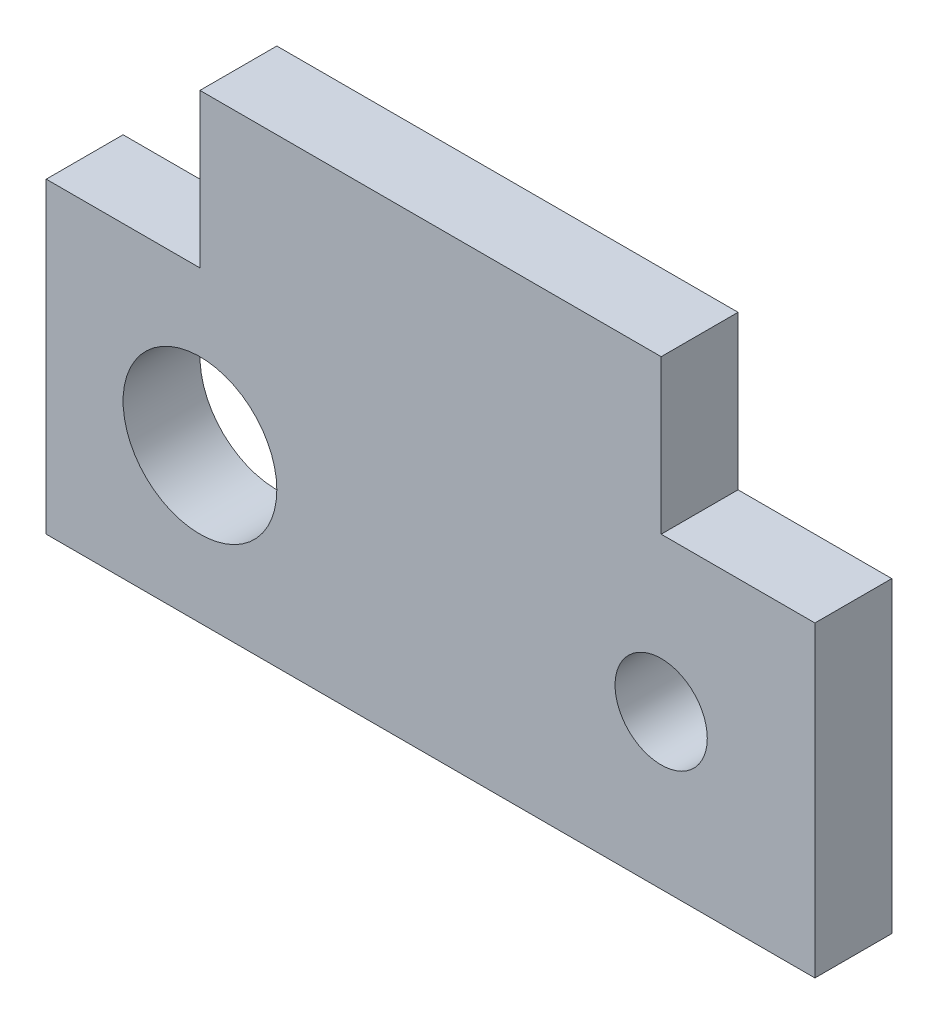
ISO-10303-21;
HEADER;
FILE_DESCRIPTION(('STEP AP214'),'2;1');
FILE_NAME('part.step','',(''),(''),'','','');
FILE_SCHEMA(('AUTOMOTIVE_DESIGN { 1 0 10303 214 1 1 1 1 }'));
ENDSEC;
DATA;
#1=APPLICATION_CONTEXT('core data for automotive mechanical design processes');
#2=APPLICATION_PROTOCOL_DEFINITION('international standard','automotive_design',2000,#1);
#3=PRODUCT_CONTEXT('',#1,'mechanical');
#4=PRODUCT('Part','Part','',(#3));
#5=PRODUCT_RELATED_PRODUCT_CATEGORY('part','',(#4));
#6=PRODUCT_DEFINITION_FORMATION('','',#4);
#7=PRODUCT_DEFINITION_CONTEXT('part definition',#1,'design');
#8=PRODUCT_DEFINITION('design','',#6,#7);
#9=PRODUCT_DEFINITION_SHAPE('','',#8);
#10=(LENGTH_UNIT() NAMED_UNIT(*) SI_UNIT(.MILLI.,.METRE.));
#11=(NAMED_UNIT(*) PLANE_ANGLE_UNIT() SI_UNIT($,.RADIAN.));
#12=(NAMED_UNIT(*) SI_UNIT($,.STERADIAN.) SOLID_ANGLE_UNIT());
#13=UNCERTAINTY_MEASURE_WITH_UNIT(LENGTH_MEASURE(1.E-05),#10,'distance_accuracy_value','');
#14=(GEOMETRIC_REPRESENTATION_CONTEXT(3) GLOBAL_UNCERTAINTY_ASSIGNED_CONTEXT((#13)) GLOBAL_UNIT_ASSIGNED_CONTEXT((#10,
#11,#12)) REPRESENTATION_CONTEXT('',''));
#15=CARTESIAN_POINT('',(0.,0.,0.));
#16=DIRECTION('',(0.,0.,1.));
#17=DIRECTION('',(1.,0.,0.));
#18=AXIS2_PLACEMENT_3D('',#15,#16,#17);
#19=CARTESIAN_POINT('',(0.,0.,5.));
#20=DIRECTION('',(0.,0.,-1.));
#21=DIRECTION('',(-1.,0.,0.));
#22=AXIS2_PLACEMENT_3D('',#19,#20,#21);
#23=PLANE('',#22);
#24=DIRECTION('',(0.,-1.,0.));
#25=VECTOR('',#24,1.);
#26=CARTESIAN_POINT('',(0.,0.,5.));
#27=LINE('',#26,#25);
#28=CARTESIAN_POINT('',(0.,20.,5.));
#29=VERTEX_POINT('',#28);
#30=CARTESIAN_POINT('',(0.,0.,5.));
#31=VERTEX_POINT('',#30);
#32=EDGE_CURVE('E145',#29,#31,#27,.T.);
#33=ORIENTED_EDGE('',*,*,#32,.T.);
#34=DIRECTION('',(1.,0.,0.));
#35=VECTOR('',#34,1.);
#36=CARTESIAN_POINT('',(0.,0.,5.));
#37=LINE('',#36,#35);
#38=CARTESIAN_POINT('',(50.,0.,5.));
#39=VERTEX_POINT('',#38);
#40=EDGE_CURVE('E93',#31,#39,#37,.T.);
#41=ORIENTED_EDGE('',*,*,#40,.T.);
#42=DIRECTION('',(0.,1.,0.));
#43=VECTOR('',#42,1.);
#44=CARTESIAN_POINT('',(50.,0.,5.));
#45=LINE('',#44,#43);
#46=CARTESIAN_POINT('',(50.,20.,5.));
#47=VERTEX_POINT('',#46);
#48=EDGE_CURVE('E160',#39,#47,#45,.T.);
#49=ORIENTED_EDGE('',*,*,#48,.T.);
#50=DIRECTION('',(-1.,0.,0.));
#51=VECTOR('',#50,1.);
#52=CARTESIAN_POINT('',(40.,20.,5.));
#53=LINE('',#52,#51);
#54=CARTESIAN_POINT('',(40.,20.,5.));
#55=VERTEX_POINT('',#54);
#56=EDGE_CURVE('E173',#47,#55,#53,.T.);
#57=ORIENTED_EDGE('',*,*,#56,.T.);
#58=DIRECTION('',(0.,1.,0.));
#59=VECTOR('',#58,1.);
#60=CARTESIAN_POINT('',(40.,20.,5.));
#61=LINE('',#60,#59);
#62=CARTESIAN_POINT('',(40.,30.,5.));
#63=VERTEX_POINT('',#62);
#64=EDGE_CURVE('E112',#55,#63,#61,.T.);
#65=ORIENTED_EDGE('',*,*,#64,.T.);
#66=DIRECTION('',(-1.,0.,0.));
#67=VECTOR('',#66,1.);
#68=CARTESIAN_POINT('',(40.,30.,5.));
#69=LINE('',#68,#67);
#70=CARTESIAN_POINT('',(10.,30.,5.));
#71=VERTEX_POINT('',#70);
#72=EDGE_CURVE('E106',#63,#71,#69,.T.);
#73=ORIENTED_EDGE('',*,*,#72,.T.);
#74=DIRECTION('',(0.,-1.,0.));
#75=VECTOR('',#74,1.);
#76=CARTESIAN_POINT('',(10.,20.,5.));
#77=LINE('',#76,#75);
#78=CARTESIAN_POINT('',(10.,20.,5.));
#79=VERTEX_POINT('',#78);
#80=EDGE_CURVE('E110',#71,#79,#77,.T.);
#81=ORIENTED_EDGE('',*,*,#80,.T.);
#82=DIRECTION('',(-1.,0.,0.));
#83=VECTOR('',#82,1.);
#84=CARTESIAN_POINT('',(0.,20.,5.));
#85=LINE('',#84,#83);
#86=EDGE_CURVE('E50',#79,#29,#85,.T.);
#87=ORIENTED_EDGE('',*,*,#86,.T.);
#88=EDGE_LOOP('',(#33,#41,#49,#57,#65,#73,#81,#87));
#89=FACE_BOUND('',#88,.T.);
#90=CARTESIAN_POINT('',(10.,10.,5.));
#91=DIRECTION('',(0.,0.,1.));
#92=DIRECTION('',(1.,0.,0.));
#93=AXIS2_PLACEMENT_3D('',#90,#91,#92);
#94=CIRCLE('',#93,5.);
#95=CARTESIAN_POINT('',(15.,10.,5.));
#96=VERTEX_POINT('',#95);
#97=EDGE_CURVE('E134',#96,#96,#94,.T.);
#98=ORIENTED_EDGE('',*,*,#97,.F.);
#99=EDGE_LOOP('',(#98));
#100=FACE_BOUND('',#99,.T.);
#101=CARTESIAN_POINT('',(40.,10.,5.));
#102=DIRECTION('',(0.,0.,1.));
#103=DIRECTION('',(1.,0.,0.));
#104=AXIS2_PLACEMENT_3D('',#101,#102,#103);
#105=CIRCLE('',#104,3.);
#106=CARTESIAN_POINT('',(43.,10.,5.));
#107=VERTEX_POINT('',#106);
#108=EDGE_CURVE('E182',#107,#107,#105,.T.);
#109=ORIENTED_EDGE('',*,*,#108,.F.);
#110=EDGE_LOOP('',(#109));
#111=FACE_BOUND('',#110,.T.);
#112=ADVANCED_FACE('F33',(#89,#100,#111),#23,.F.);
#113=CARTESIAN_POINT('',(0.,0.,0.));
#114=DIRECTION('',(0.,0.,-1.));
#115=DIRECTION('',(-1.,0.,0.));
#116=AXIS2_PLACEMENT_3D('',#113,#114,#115);
#117=PLANE('',#116);
#118=CARTESIAN_POINT('',(10.,10.,0.));
#119=DIRECTION('',(0.,0.,1.));
#120=DIRECTION('',(1.,0.,0.));
#121=AXIS2_PLACEMENT_3D('',#118,#119,#120);
#122=CIRCLE('',#121,5.);
#123=CARTESIAN_POINT('',(15.,10.,0.));
#124=VERTEX_POINT('',#123);
#125=EDGE_CURVE('E179',#124,#124,#122,.T.);
#126=ORIENTED_EDGE('',*,*,#125,.T.);
#127=EDGE_LOOP('',(#126));
#128=FACE_BOUND('',#127,.T.);
#129=DIRECTION('',(0.,-1.,0.));
#130=VECTOR('',#129,1.);
#131=CARTESIAN_POINT('',(0.,0.,0.));
#132=LINE('',#131,#130);
#133=CARTESIAN_POINT('',(0.,20.,0.));
#134=VERTEX_POINT('',#133);
#135=CARTESIAN_POINT('',(0.,0.,0.));
#136=VERTEX_POINT('',#135);
#137=EDGE_CURVE('E130',#134,#136,#132,.T.);
#138=ORIENTED_EDGE('',*,*,#137,.F.);
#139=DIRECTION('',(-1.,0.,0.));
#140=VECTOR('',#139,1.);
#141=CARTESIAN_POINT('',(0.,20.,0.));
#142=LINE('',#141,#140);
#143=CARTESIAN_POINT('',(10.,20.,0.));
#144=VERTEX_POINT('',#143);
#145=EDGE_CURVE('E85',#144,#134,#142,.T.);
#146=ORIENTED_EDGE('',*,*,#145,.F.);
#147=DIRECTION('',(0.,-1.,0.));
#148=VECTOR('',#147,1.);
#149=CARTESIAN_POINT('',(10.,20.,0.));
#150=LINE('',#149,#148);
#151=CARTESIAN_POINT('',(10.,30.,0.));
#152=VERTEX_POINT('',#151);
#153=EDGE_CURVE('E79',#152,#144,#150,.T.);
#154=ORIENTED_EDGE('',*,*,#153,.F.);
#155=DIRECTION('',(-1.,0.,0.));
#156=VECTOR('',#155,1.);
#157=CARTESIAN_POINT('',(40.,30.,0.));
#158=LINE('',#157,#156);
#159=CARTESIAN_POINT('',(40.,30.,0.));
#160=VERTEX_POINT('',#159);
#161=EDGE_CURVE('E120',#160,#152,#158,.T.);
#162=ORIENTED_EDGE('',*,*,#161,.F.);
#163=DIRECTION('',(0.,1.,0.));
#164=VECTOR('',#163,1.);
#165=CARTESIAN_POINT('',(40.,20.,0.));
#166=LINE('',#165,#164);
#167=CARTESIAN_POINT('',(40.,20.,0.));
#168=VERTEX_POINT('',#167);
#169=EDGE_CURVE('E140',#168,#160,#166,.T.);
#170=ORIENTED_EDGE('',*,*,#169,.F.);
#171=DIRECTION('',(-1.,0.,0.));
#172=VECTOR('',#171,1.);
#173=CARTESIAN_POINT('',(40.,20.,0.));
#174=LINE('',#173,#172);
#175=CARTESIAN_POINT('',(50.,20.,0.));
#176=VERTEX_POINT('',#175);
#177=EDGE_CURVE('E138',#176,#168,#174,.T.);
#178=ORIENTED_EDGE('',*,*,#177,.F.);
#179=DIRECTION('',(0.,1.,0.));
#180=VECTOR('',#179,1.);
#181=CARTESIAN_POINT('',(50.,0.,0.));
#182=LINE('',#181,#180);
#183=CARTESIAN_POINT('',(50.,0.,0.));
#184=VERTEX_POINT('',#183);
#185=EDGE_CURVE('E136',#184,#176,#182,.T.);
#186=ORIENTED_EDGE('',*,*,#185,.F.);
#187=DIRECTION('',(1.,0.,0.));
#188=VECTOR('',#187,1.);
#189=CARTESIAN_POINT('',(0.,0.,0.));
#190=LINE('',#189,#188);
#191=EDGE_CURVE('E133',#136,#184,#190,.T.);
#192=ORIENTED_EDGE('',*,*,#191,.F.);
#193=EDGE_LOOP('',(#138,#146,#154,#162,#170,#178,#186,#192));
#194=FACE_BOUND('',#193,.T.);
#195=CARTESIAN_POINT('',(40.,10.,0.));
#196=DIRECTION('',(0.,0.,1.));
#197=DIRECTION('',(1.,0.,0.));
#198=AXIS2_PLACEMENT_3D('',#195,#196,#197);
#199=CIRCLE('',#198,3.);
#200=CARTESIAN_POINT('',(43.,10.,0.));
#201=VERTEX_POINT('',#200);
#202=EDGE_CURVE('E185',#201,#201,#199,.T.);
#203=ORIENTED_EDGE('',*,*,#202,.T.);
#204=EDGE_LOOP('',(#203));
#205=FACE_BOUND('',#204,.T.);
#206=ADVANCED_FACE('F164',(#128,#194,#205),#117,.T.);
#207=CARTESIAN_POINT('',(0.,0.,5.));
#208=DIRECTION('',(1.,0.,0.));
#209=DIRECTION('',(0.,0.,-1.));
#210=AXIS2_PLACEMENT_3D('',#207,#208,#209);
#211=PLANE('',#210);
#212=ORIENTED_EDGE('',*,*,#137,.T.);
#213=DIRECTION('',(0.,0.,-1.));
#214=VECTOR('',#213,1.);
#215=CARTESIAN_POINT('',(0.,0.,5.));
#216=LINE('',#215,#214);
#217=EDGE_CURVE('E11',#31,#136,#216,.T.);
#218=ORIENTED_EDGE('',*,*,#217,.F.);
#219=ORIENTED_EDGE('',*,*,#32,.F.);
#220=DIRECTION('',(0.,0.,-1.));
#221=VECTOR('',#220,1.);
#222=CARTESIAN_POINT('',(0.,20.,5.));
#223=LINE('',#222,#221);
#224=EDGE_CURVE('E126',#29,#134,#223,.T.);
#225=ORIENTED_EDGE('',*,*,#224,.T.);
#226=EDGE_LOOP('',(#212,#218,#219,#225));
#227=FACE_BOUND('',#226,.T.);
#228=ADVANCED_FACE('F35',(#227),#211,.F.);
#229=CARTESIAN_POINT('',(0.,0.,5.));
#230=DIRECTION('',(0.,1.,0.));
#231=DIRECTION('',(0.,0.,1.));
#232=AXIS2_PLACEMENT_3D('',#229,#230,#231);
#233=PLANE('',#232);
#234=ORIENTED_EDGE('',*,*,#191,.T.);
#235=DIRECTION('',(0.,0.,-1.));
#236=VECTOR('',#235,1.);
#237=CARTESIAN_POINT('',(50.,0.,5.));
#238=LINE('',#237,#236);
#239=EDGE_CURVE('E42',#39,#184,#238,.T.);
#240=ORIENTED_EDGE('',*,*,#239,.F.);
#241=ORIENTED_EDGE('',*,*,#40,.F.);
#242=ORIENTED_EDGE('',*,*,#217,.T.);
#243=EDGE_LOOP('',(#234,#240,#241,#242));
#244=FACE_BOUND('',#243,.T.);
#245=ADVANCED_FACE('F217',(#244),#233,.F.);
#246=CARTESIAN_POINT('',(50.,0.,5.));
#247=DIRECTION('',(-1.,0.,0.));
#248=DIRECTION('',(0.,0.,1.));
#249=AXIS2_PLACEMENT_3D('',#246,#247,#248);
#250=PLANE('',#249);
#251=ORIENTED_EDGE('',*,*,#185,.T.);
#252=DIRECTION('',(0.,0.,-1.));
#253=VECTOR('',#252,1.);
#254=CARTESIAN_POINT('',(50.,20.,5.));
#255=LINE('',#254,#253);
#256=EDGE_CURVE('E152',#47,#176,#255,.T.);
#257=ORIENTED_EDGE('',*,*,#256,.F.);
#258=ORIENTED_EDGE('',*,*,#48,.F.);
#259=ORIENTED_EDGE('',*,*,#239,.T.);
#260=EDGE_LOOP('',(#251,#257,#258,#259));
#261=FACE_BOUND('',#260,.T.);
#262=ADVANCED_FACE('F158',(#261),#250,.F.);
#263=CARTESIAN_POINT('',(40.,20.,5.));
#264=DIRECTION('',(0.,-1.,0.));
#265=DIRECTION('',(0.,0.,-1.));
#266=AXIS2_PLACEMENT_3D('',#263,#264,#265);
#267=PLANE('',#266);
#268=ORIENTED_EDGE('',*,*,#177,.T.);
#269=DIRECTION('',(0.,0.,-1.));
#270=VECTOR('',#269,1.);
#271=CARTESIAN_POINT('',(40.,20.,5.));
#272=LINE('',#271,#270);
#273=EDGE_CURVE('E149',#55,#168,#272,.T.);
#274=ORIENTED_EDGE('',*,*,#273,.F.);
#275=ORIENTED_EDGE('',*,*,#56,.F.);
#276=ORIENTED_EDGE('',*,*,#256,.T.);
#277=EDGE_LOOP('',(#268,#274,#275,#276));
#278=FACE_BOUND('',#277,.T.);
#279=ADVANCED_FACE('F169',(#278),#267,.F.);
#280=CARTESIAN_POINT('',(40.,20.,5.));
#281=DIRECTION('',(-1.,0.,0.));
#282=DIRECTION('',(0.,0.,1.));
#283=AXIS2_PLACEMENT_3D('',#280,#281,#282);
#284=PLANE('',#283);
#285=ORIENTED_EDGE('',*,*,#169,.T.);
#286=DIRECTION('',(0.,0.,-1.));
#287=VECTOR('',#286,1.);
#288=CARTESIAN_POINT('',(40.,30.,5.));
#289=LINE('',#288,#287);
#290=EDGE_CURVE('E121',#63,#160,#289,.T.);
#291=ORIENTED_EDGE('',*,*,#290,.F.);
#292=ORIENTED_EDGE('',*,*,#64,.F.);
#293=ORIENTED_EDGE('',*,*,#273,.T.);
#294=EDGE_LOOP('',(#285,#291,#292,#293));
#295=FACE_BOUND('',#294,.T.);
#296=ADVANCED_FACE('F172',(#295),#284,.F.);
#297=CARTESIAN_POINT('',(40.,30.,5.));
#298=DIRECTION('',(0.,-1.,0.));
#299=DIRECTION('',(0.,0.,-1.));
#300=AXIS2_PLACEMENT_3D('',#297,#298,#299);
#301=PLANE('',#300);
#302=ORIENTED_EDGE('',*,*,#161,.T.);
#303=DIRECTION('',(0.,0.,-1.));
#304=VECTOR('',#303,1.);
#305=CARTESIAN_POINT('',(10.,30.,5.));
#306=LINE('',#305,#304);
#307=EDGE_CURVE('E117',#71,#152,#306,.T.);
#308=ORIENTED_EDGE('',*,*,#307,.F.);
#309=ORIENTED_EDGE('',*,*,#72,.F.);
#310=ORIENTED_EDGE('',*,*,#290,.T.);
#311=EDGE_LOOP('',(#302,#308,#309,#310));
#312=FACE_BOUND('',#311,.T.);
#313=ADVANCED_FACE('F118',(#312),#301,.F.);
#314=CARTESIAN_POINT('',(10.,20.,5.));
#315=DIRECTION('',(1.,0.,0.));
#316=DIRECTION('',(0.,1.,0.));
#317=AXIS2_PLACEMENT_3D('',#314,#315,#316);
#318=PLANE('',#317);
#319=ORIENTED_EDGE('',*,*,#153,.T.);
#320=DIRECTION('',(0.,0.,-1.));
#321=VECTOR('',#320,1.);
#322=CARTESIAN_POINT('',(10.,20.,5.));
#323=LINE('',#322,#321);
#324=EDGE_CURVE('E122',#79,#144,#323,.T.);
#325=ORIENTED_EDGE('',*,*,#324,.F.);
#326=ORIENTED_EDGE('',*,*,#80,.F.);
#327=ORIENTED_EDGE('',*,*,#307,.T.);
#328=EDGE_LOOP('',(#319,#325,#326,#327));
#329=FACE_BOUND('',#328,.T.);
#330=ADVANCED_FACE('F124',(#329),#318,.F.);
#331=CARTESIAN_POINT('',(0.,20.,5.));
#332=DIRECTION('',(0.,-1.,0.));
#333=DIRECTION('',(1.,0.,0.));
#334=AXIS2_PLACEMENT_3D('',#331,#332,#333);
#335=PLANE('',#334);
#336=ORIENTED_EDGE('',*,*,#145,.T.);
#337=ORIENTED_EDGE('',*,*,#224,.F.);
#338=ORIENTED_EDGE('',*,*,#86,.F.);
#339=ORIENTED_EDGE('',*,*,#324,.T.);
#340=EDGE_LOOP('',(#336,#337,#338,#339));
#341=FACE_BOUND('',#340,.T.);
#342=ADVANCED_FACE('F205',(#341),#335,.F.);
#343=CARTESIAN_POINT('',(10.,10.,5.));
#344=DIRECTION('',(0.,0.,-1.));
#345=DIRECTION('',(-1.,0.,0.));
#346=AXIS2_PLACEMENT_3D('',#343,#344,#345);
#347=CYLINDRICAL_SURFACE('',#346,5.);
#348=ORIENTED_EDGE('',*,*,#97,.T.);
#349=EDGE_LOOP('',(#348));
#350=FACE_BOUND('',#349,.T.);
#351=ORIENTED_EDGE('',*,*,#125,.F.);
#352=EDGE_LOOP('',(#351));
#353=FACE_BOUND('',#352,.T.);
#354=ADVANCED_FACE('F202',(#350,#353),#347,.F.);
#355=CARTESIAN_POINT('',(40.,10.,5.));
#356=DIRECTION('',(0.,0.,-1.));
#357=DIRECTION('',(-1.,0.,0.));
#358=AXIS2_PLACEMENT_3D('',#355,#356,#357);
#359=CYLINDRICAL_SURFACE('',#358,3.);
#360=ORIENTED_EDGE('',*,*,#108,.T.);
#361=EDGE_LOOP('',(#360));
#362=FACE_BOUND('',#361,.T.);
#363=ORIENTED_EDGE('',*,*,#202,.F.);
#364=EDGE_LOOP('',(#363));
#365=FACE_BOUND('',#364,.T.);
#366=ADVANCED_FACE('F191',(#362,#365),#359,.F.);
#367=CLOSED_SHELL('',(#112,#206,#228,#245,#262,#279,#296,#313,#330,#342,#354,#366));
#368=MANIFOLD_SOLID_BREP('B2',#367);
#369=ADVANCED_BREP_SHAPE_REPRESENTATION('',(#18,#368),#14);
#370=SHAPE_DEFINITION_REPRESENTATION(#9,#369);
ENDSEC;
END-ISO-10303-21;
